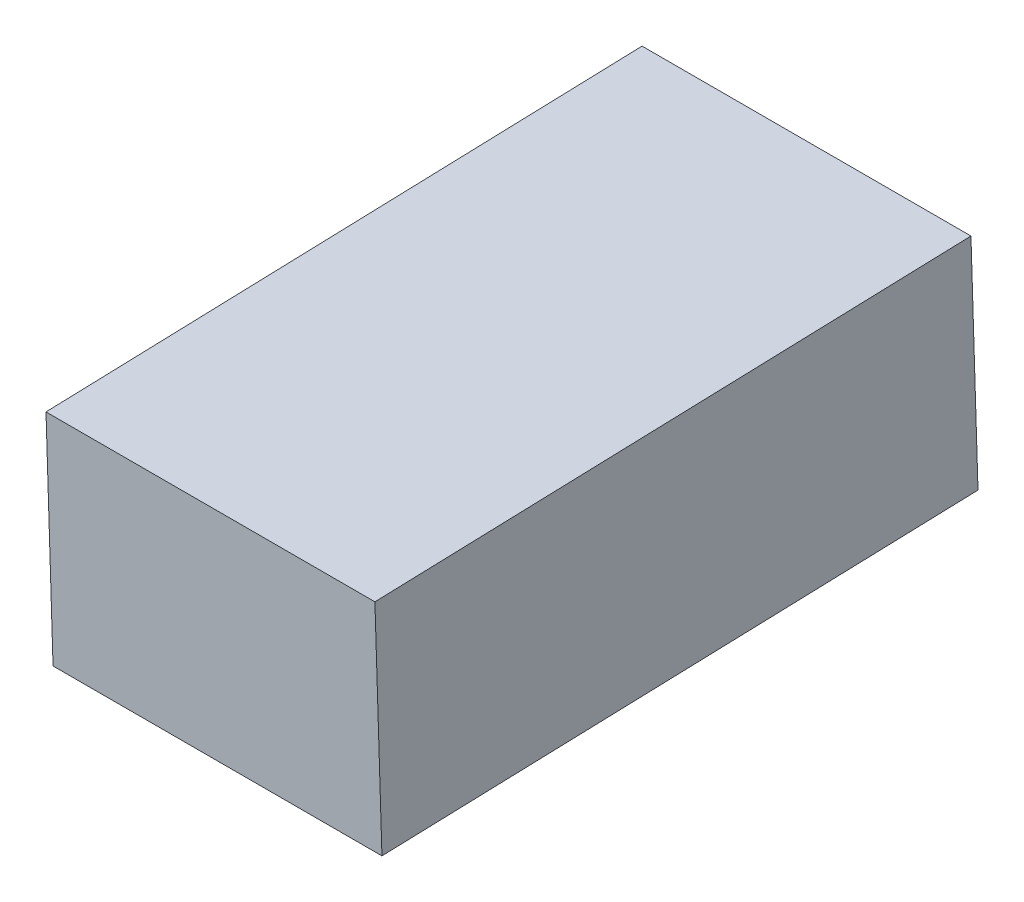
ISO-10303-21;
HEADER;
FILE_DESCRIPTION(('STEP AP214'),'2;1');
FILE_NAME('part.step','',(''),(''),'','','');
FILE_SCHEMA(('AUTOMOTIVE_DESIGN { 1 0 10303 214 1 1 1 1 }'));
ENDSEC;
DATA;
#1=APPLICATION_CONTEXT('core data for automotive mechanical design processes');
#2=APPLICATION_PROTOCOL_DEFINITION('international standard','automotive_design',2000,#1);
#3=PRODUCT_CONTEXT('',#1,'mechanical');
#4=PRODUCT('Part','Part','',(#3));
#5=PRODUCT_RELATED_PRODUCT_CATEGORY('part','',(#4));
#6=PRODUCT_DEFINITION_FORMATION('','',#4);
#7=PRODUCT_DEFINITION_CONTEXT('part definition',#1,'design');
#8=PRODUCT_DEFINITION('design','',#6,#7);
#9=PRODUCT_DEFINITION_SHAPE('','',#8);
#10=(LENGTH_UNIT() NAMED_UNIT(*) SI_UNIT(.MILLI.,.METRE.));
#11=(NAMED_UNIT(*) PLANE_ANGLE_UNIT() SI_UNIT($,.RADIAN.));
#12=(NAMED_UNIT(*) SI_UNIT($,.STERADIAN.) SOLID_ANGLE_UNIT());
#13=UNCERTAINTY_MEASURE_WITH_UNIT(LENGTH_MEASURE(1.E-05),#10,'distance_accuracy_value','');
#14=(GEOMETRIC_REPRESENTATION_CONTEXT(3) GLOBAL_UNCERTAINTY_ASSIGNED_CONTEXT((#13)) GLOBAL_UNIT_ASSIGNED_CONTEXT((#10,
#11,#12)) REPRESENTATION_CONTEXT('',''));
#15=CARTESIAN_POINT('',(0.,0.,0.));
#16=DIRECTION('',(0.,0.,1.));
#17=DIRECTION('',(1.,0.,0.));
#18=AXIS2_PLACEMENT_3D('',#15,#16,#17);
#19=CARTESIAN_POINT('',(135.5,-22.4437270808813,139.736688372908));
#20=DIRECTION('',(1.,0.,0.));
#21=DIRECTION('',(0.,0.999503911930264,0.0314949207984439));
#22=AXIS2_PLACEMENT_3D('',#19,#20,#21);
#23=PLANE('',#22);
#24=DIRECTION('',(0.,-0.999503911930264,-0.0314949207984439));
#25=VECTOR('',#24,1.);
#26=CARTESIAN_POINT('',(135.499999999999,-14.7064040838531,-105.810352462318));
#27=LINE('',#26,#25);
#28=CARTESIAN_POINT('',(135.499999999999,77.3995178343232,-102.908043945808));
#29=VERTEX_POINT('',#28);
#30=CARTESIAN_POINT('',(135.499999999999,-106.812326002029,-108.712660978829));
#31=VERTEX_POINT('',#30);
#32=EDGE_CURVE('E10',#29,#31,#27,.T.);
#33=ORIENTED_EDGE('',*,*,#32,.F.);
#34=DIRECTION('',(0.,0.0314949207984438,-0.999503911930264));
#35=VECTOR('',#34,1.);
#36=CARTESIAN_POINT('',(135.5,69.662194837295,142.638996889418));
#37=LINE('',#36,#35);
#38=CARTESIAN_POINT('',(135.500000000001,61.9248718402668,388.186037724644));
#39=VERTEX_POINT('',#38);
#40=EDGE_CURVE('E60',#39,#29,#37,.T.);
#41=ORIENTED_EDGE('',*,*,#40,.F.);
#42=DIRECTION('',(0.,0.999503911930264,0.0314949207984439));
#43=VECTOR('',#42,1.);
#44=CARTESIAN_POINT('',(135.500000000001,-30.1810500779095,385.283729208133));
#45=LINE('',#44,#43);
#46=CARTESIAN_POINT('',(135.500000000001,-122.286971996086,382.381420691623));
#47=VERTEX_POINT('',#46);
#48=EDGE_CURVE('E86',#47,#39,#45,.T.);
#49=ORIENTED_EDGE('',*,*,#48,.F.);
#50=DIRECTION('',(0.,-0.0314949207984438,0.999503911930264));
#51=VECTOR('',#50,1.);
#52=CARTESIAN_POINT('',(135.5,-114.549648999058,136.834379856397));
#53=LINE('',#52,#51);
#54=EDGE_CURVE('E23',#31,#47,#53,.T.);
#55=ORIENTED_EDGE('',*,*,#54,.F.);
#56=EDGE_LOOP('',(#33,#41,#49,#55));
#57=FACE_BOUND('',#56,.T.);
#58=ADVANCED_FACE('F16',(#57),#23,.T.);
#59=CARTESIAN_POINT('',(-135.5,-14.7064040838531,-105.810352462317));
#60=DIRECTION('',(0.,0.0314949207984438,-0.999503911930264));
#61=DIRECTION('',(-1.,0.,0.));
#62=AXIS2_PLACEMENT_3D('',#59,#60,#61);
#63=PLANE('',#62);
#64=DIRECTION('',(1.,0.,0.));
#65=VECTOR('',#64,1.);
#66=CARTESIAN_POINT('',(-135.5,77.3995178343231,-102.908043945807));
#67=LINE('',#66,#65);
#68=CARTESIAN_POINT('',(-135.5,77.3995178343231,-102.908043945807));
#69=VERTEX_POINT('',#68);
#70=EDGE_CURVE('E53',#69,#29,#67,.T.);
#71=ORIENTED_EDGE('',*,*,#70,.T.);
#72=ORIENTED_EDGE('',*,*,#32,.T.);
#73=DIRECTION('',(1.,0.,0.));
#74=VECTOR('',#73,1.);
#75=CARTESIAN_POINT('',(-135.5,-106.812326002029,-108.712660978827));
#76=LINE('',#75,#74);
#77=CARTESIAN_POINT('',(-135.5,-106.812326002029,-108.712660978827));
#78=VERTEX_POINT('',#77);
#79=EDGE_CURVE('E66',#78,#31,#76,.T.);
#80=ORIENTED_EDGE('',*,*,#79,.F.);
#81=DIRECTION('',(0.,0.999503911930264,0.0314949207984439));
#82=VECTOR('',#81,1.);
#83=CARTESIAN_POINT('',(-135.5,-14.7064040838531,-105.810352462317));
#84=LINE('',#83,#82);
#85=EDGE_CURVE('E64',#78,#69,#84,.T.);
#86=ORIENTED_EDGE('',*,*,#85,.T.);
#87=EDGE_LOOP('',(#71,#72,#80,#86));
#88=FACE_BOUND('',#87,.T.);
#89=ADVANCED_FACE('F65',(#88),#63,.T.);
#90=CARTESIAN_POINT('',(-135.499999999999,-114.549648999058,136.834379856398));
#91=DIRECTION('',(0.,-0.999503911930264,-0.0314949207984439));
#92=DIRECTION('',(1.,0.,0.));
#93=AXIS2_PLACEMENT_3D('',#90,#91,#92);
#94=PLANE('',#93);
#95=ORIENTED_EDGE('',*,*,#79,.T.);
#96=ORIENTED_EDGE('',*,*,#54,.T.);
#97=DIRECTION('',(1.,0.,0.));
#98=VECTOR('',#97,1.);
#99=CARTESIAN_POINT('',(-135.499999999998,-122.286971996086,382.381420691624));
#100=LINE('',#99,#98);
#101=CARTESIAN_POINT('',(-135.499999999998,-122.286971996086,382.381420691624));
#102=VERTEX_POINT('',#101);
#103=EDGE_CURVE('E81',#102,#47,#100,.T.);
#104=ORIENTED_EDGE('',*,*,#103,.F.);
#105=DIRECTION('',(0.,0.0314949207984438,-0.999503911930264));
#106=VECTOR('',#105,1.);
#107=CARTESIAN_POINT('',(-135.499999999999,-114.549648999058,136.834379856398));
#108=LINE('',#107,#106);
#109=EDGE_CURVE('E70',#102,#78,#108,.T.);
#110=ORIENTED_EDGE('',*,*,#109,.T.);
#111=EDGE_LOOP('',(#95,#96,#104,#110));
#112=FACE_BOUND('',#111,.T.);
#113=ADVANCED_FACE('F90',(#112),#94,.T.);
#114=CARTESIAN_POINT('',(-135.499999999998,-30.1810500779095,385.283729208134));
#115=DIRECTION('',(0.,-0.0314949207984438,0.999503911930264));
#116=DIRECTION('',(1.,0.,0.));
#117=AXIS2_PLACEMENT_3D('',#114,#115,#116);
#118=PLANE('',#117);
#119=ORIENTED_EDGE('',*,*,#103,.T.);
#120=ORIENTED_EDGE('',*,*,#48,.T.);
#121=DIRECTION('',(1.,0.,0.));
#122=VECTOR('',#121,1.);
#123=CARTESIAN_POINT('',(-135.499999999998,61.9248718402667,388.186037724645));
#124=LINE('',#123,#122);
#125=CARTESIAN_POINT('',(-135.499999999998,61.9248718402667,388.186037724645));
#126=VERTEX_POINT('',#125);
#127=EDGE_CURVE('E61',#126,#39,#124,.T.);
#128=ORIENTED_EDGE('',*,*,#127,.F.);
#129=DIRECTION('',(0.,-0.999503911930264,-0.0314949207984439));
#130=VECTOR('',#129,1.);
#131=CARTESIAN_POINT('',(-135.499999999998,-30.1810500779095,385.283729208134));
#132=LINE('',#131,#130);
#133=EDGE_CURVE('E75',#126,#102,#132,.T.);
#134=ORIENTED_EDGE('',*,*,#133,.T.);
#135=EDGE_LOOP('',(#119,#120,#128,#134));
#136=FACE_BOUND('',#135,.T.);
#137=ADVANCED_FACE('F88',(#136),#118,.T.);
#138=CARTESIAN_POINT('',(-135.499999999999,-22.4437270808813,139.736688372909));
#139=DIRECTION('',(-1.,0.,0.));
#140=DIRECTION('',(0.,-0.999503911930264,-0.0314949207984439));
#141=AXIS2_PLACEMENT_3D('',#138,#139,#140);
#142=PLANE('',#141);
#143=DIRECTION('',(0.,-0.0314949207984438,0.999503911930264));
#144=VECTOR('',#143,1.);
#145=CARTESIAN_POINT('',(-135.499999999999,69.6621948372949,142.638996889419));
#146=LINE('',#145,#144);
#147=EDGE_CURVE('E58',#69,#126,#146,.T.);
#148=ORIENTED_EDGE('',*,*,#147,.F.);
#149=ORIENTED_EDGE('',*,*,#85,.F.);
#150=ORIENTED_EDGE('',*,*,#109,.F.);
#151=ORIENTED_EDGE('',*,*,#133,.F.);
#152=EDGE_LOOP('',(#148,#149,#150,#151));
#153=FACE_BOUND('',#152,.T.);
#154=ADVANCED_FACE('F73',(#153),#142,.T.);
#155=CARTESIAN_POINT('',(-135.499999999999,69.6621948372949,142.638996889419));
#156=DIRECTION('',(0.,0.999503911930264,0.0314949207984439));
#157=DIRECTION('',(-1.,0.,0.));
#158=AXIS2_PLACEMENT_3D('',#155,#156,#157);
#159=PLANE('',#158);
#160=ORIENTED_EDGE('',*,*,#147,.T.);
#161=ORIENTED_EDGE('',*,*,#127,.T.);
#162=ORIENTED_EDGE('',*,*,#40,.T.);
#163=ORIENTED_EDGE('',*,*,#70,.F.);
#164=EDGE_LOOP('',(#160,#161,#162,#163));
#165=FACE_BOUND('',#164,.T.);
#166=ADVANCED_FACE('F55',(#165),#159,.T.);
#167=CLOSED_SHELL('',(#58,#89,#113,#137,#154,#166));
#168=MANIFOLD_SOLID_BREP('B1',#167);
#169=ADVANCED_BREP_SHAPE_REPRESENTATION('',(#18,#168),#14);
#170=SHAPE_DEFINITION_REPRESENTATION(#9,#169);
ENDSEC;
END-ISO-10303-21;
